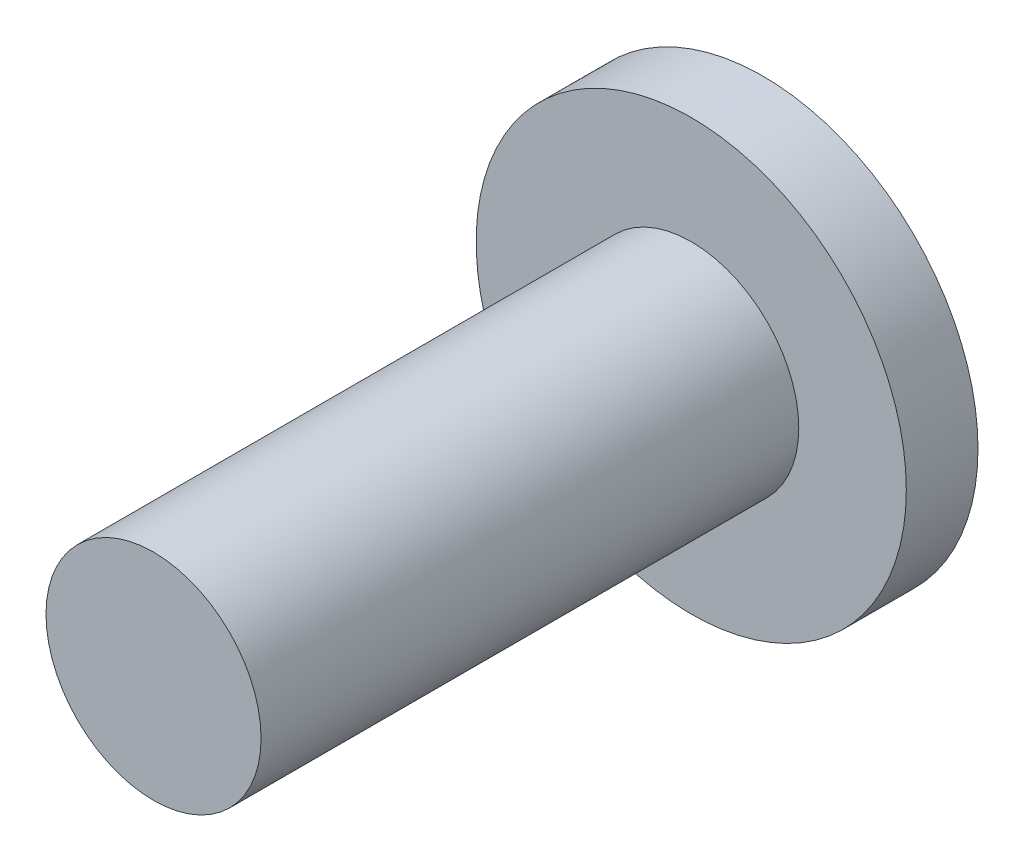
ISO-10303-21;
HEADER;
FILE_DESCRIPTION(('STEP AP214'),'2;1');
FILE_NAME('part.step','',(''),(''),'','','');
FILE_SCHEMA(('AUTOMOTIVE_DESIGN { 1 0 10303 214 1 1 1 1 }'));
ENDSEC;
DATA;
#1=APPLICATION_CONTEXT('core data for automotive mechanical design processes');
#2=APPLICATION_PROTOCOL_DEFINITION('international standard','automotive_design',2000,#1);
#3=PRODUCT_CONTEXT('',#1,'mechanical');
#4=PRODUCT('Part','Part','',(#3));
#5=PRODUCT_RELATED_PRODUCT_CATEGORY('part','',(#4));
#6=PRODUCT_DEFINITION_FORMATION('','',#4);
#7=PRODUCT_DEFINITION_CONTEXT('part definition',#1,'design');
#8=PRODUCT_DEFINITION('design','',#6,#7);
#9=PRODUCT_DEFINITION_SHAPE('','',#8);
#10=(LENGTH_UNIT() NAMED_UNIT(*) SI_UNIT(.MILLI.,.METRE.));
#11=(NAMED_UNIT(*) PLANE_ANGLE_UNIT() SI_UNIT($,.RADIAN.));
#12=(NAMED_UNIT(*) SI_UNIT($,.STERADIAN.) SOLID_ANGLE_UNIT());
#13=UNCERTAINTY_MEASURE_WITH_UNIT(LENGTH_MEASURE(1.E-05),#10,'distance_accuracy_value','');
#14=(GEOMETRIC_REPRESENTATION_CONTEXT(3) GLOBAL_UNCERTAINTY_ASSIGNED_CONTEXT((#13)) GLOBAL_UNIT_ASSIGNED_CONTEXT((#10,
#11,#12)) REPRESENTATION_CONTEXT('',''));
#15=CARTESIAN_POINT('',(0.,0.,0.));
#16=DIRECTION('',(0.,0.,1.));
#17=DIRECTION('',(1.,0.,0.));
#18=AXIS2_PLACEMENT_3D('',#15,#16,#17);
#19=CARTESIAN_POINT('',(0.,0.,2.));
#20=DIRECTION('',(0.,0.,-1.));
#21=DIRECTION('',(-1.,0.,0.));
#22=AXIS2_PLACEMENT_3D('',#19,#20,#21);
#23=CYLINDRICAL_SURFACE('',#22,6.);
#24=CARTESIAN_POINT('',(0.,0.,2.));
#25=DIRECTION('',(0.,0.,1.));
#26=DIRECTION('',(1.,0.,0.));
#27=AXIS2_PLACEMENT_3D('',#24,#25,#26);
#28=CIRCLE('',#27,6.);
#29=CARTESIAN_POINT('',(6.,0.,2.));
#30=VERTEX_POINT('',#29);
#31=EDGE_CURVE('E41',#30,#30,#28,.T.);
#32=ORIENTED_EDGE('',*,*,#31,.F.);
#33=EDGE_LOOP('',(#32));
#34=FACE_BOUND('',#33,.T.);
#35=CARTESIAN_POINT('',(0.,0.,0.));
#36=DIRECTION('',(0.,0.,1.));
#37=DIRECTION('',(1.,0.,0.));
#38=AXIS2_PLACEMENT_3D('',#35,#36,#37);
#39=CIRCLE('',#38,6.);
#40=CARTESIAN_POINT('',(6.,0.,0.));
#41=VERTEX_POINT('',#40);
#42=EDGE_CURVE('E37',#41,#41,#39,.T.);
#43=ORIENTED_EDGE('',*,*,#42,.T.);
#44=EDGE_LOOP('',(#43));
#45=FACE_BOUND('',#44,.T.);
#46=ADVANCED_FACE('F34',(#34,#45),#23,.T.);
#47=CARTESIAN_POINT('',(0.,0.,2.));
#48=DIRECTION('',(0.,0.,1.));
#49=DIRECTION('',(1.,0.,0.));
#50=AXIS2_PLACEMENT_3D('',#47,#48,#49);
#51=PLANE('',#50);
#52=CARTESIAN_POINT('',(0.,0.,2.));
#53=DIRECTION('',(0.,0.,1.));
#54=DIRECTION('',(1.,0.,0.));
#55=AXIS2_PLACEMENT_3D('',#52,#53,#54);
#56=CIRCLE('',#55,3.);
#57=CARTESIAN_POINT('',(3.,0.,2.));
#58=VERTEX_POINT('',#57);
#59=EDGE_CURVE('E10',#58,#58,#56,.T.);
#60=ORIENTED_EDGE('',*,*,#59,.F.);
#61=EDGE_LOOP('',(#60));
#62=FACE_BOUND('',#61,.T.);
#63=ORIENTED_EDGE('',*,*,#31,.T.);
#64=EDGE_LOOP('',(#63));
#65=FACE_BOUND('',#64,.T.);
#66=ADVANCED_FACE('F58',(#62,#65),#51,.T.);
#67=CARTESIAN_POINT('',(0.,0.,0.));
#68=DIRECTION('',(0.,0.,1.));
#69=DIRECTION('',(1.,0.,0.));
#70=AXIS2_PLACEMENT_3D('',#67,#68,#69);
#71=PLANE('',#70);
#72=ORIENTED_EDGE('',*,*,#42,.F.);
#73=EDGE_LOOP('',(#72));
#74=FACE_BOUND('',#73,.T.);
#75=ADVANCED_FACE('F55',(#74),#71,.F.);
#76=CARTESIAN_POINT('',(0.,0.,17.));
#77=DIRECTION('',(0.,0.,-1.));
#78=DIRECTION('',(-1.,0.,0.));
#79=AXIS2_PLACEMENT_3D('',#76,#77,#78);
#80=CYLINDRICAL_SURFACE('',#79,3.);
#81=CARTESIAN_POINT('',(0.,0.,17.));
#82=DIRECTION('',(0.,0.,1.));
#83=DIRECTION('',(1.,0.,0.));
#84=AXIS2_PLACEMENT_3D('',#81,#82,#83);
#85=CIRCLE('',#84,3.);
#86=CARTESIAN_POINT('',(3.,0.,17.));
#87=VERTEX_POINT('',#86);
#88=EDGE_CURVE('E47',#87,#87,#85,.T.);
#89=ORIENTED_EDGE('',*,*,#88,.F.);
#90=EDGE_LOOP('',(#89));
#91=FACE_BOUND('',#90,.T.);
#92=ORIENTED_EDGE('',*,*,#59,.T.);
#93=EDGE_LOOP('',(#92));
#94=FACE_BOUND('',#93,.T.);
#95=ADVANCED_FACE('F57',(#91,#94),#80,.T.);
#96=CARTESIAN_POINT('',(0.,0.,17.));
#97=DIRECTION('',(0.,0.,1.));
#98=DIRECTION('',(1.,0.,0.));
#99=AXIS2_PLACEMENT_3D('',#96,#97,#98);
#100=PLANE('',#99);
#101=ORIENTED_EDGE('',*,*,#88,.T.);
#102=EDGE_LOOP('',(#101));
#103=FACE_BOUND('',#102,.T.);
#104=ADVANCED_FACE('F63',(#103),#100,.T.);
#105=CLOSED_SHELL('',(#46,#66,#75,#95,#104));
#106=MANIFOLD_SOLID_BREP('B2',#105);
#107=ADVANCED_BREP_SHAPE_REPRESENTATION('',(#18,#106),#14);
#108=SHAPE_DEFINITION_REPRESENTATION(#9,#107);
ENDSEC;
END-ISO-10303-21;
